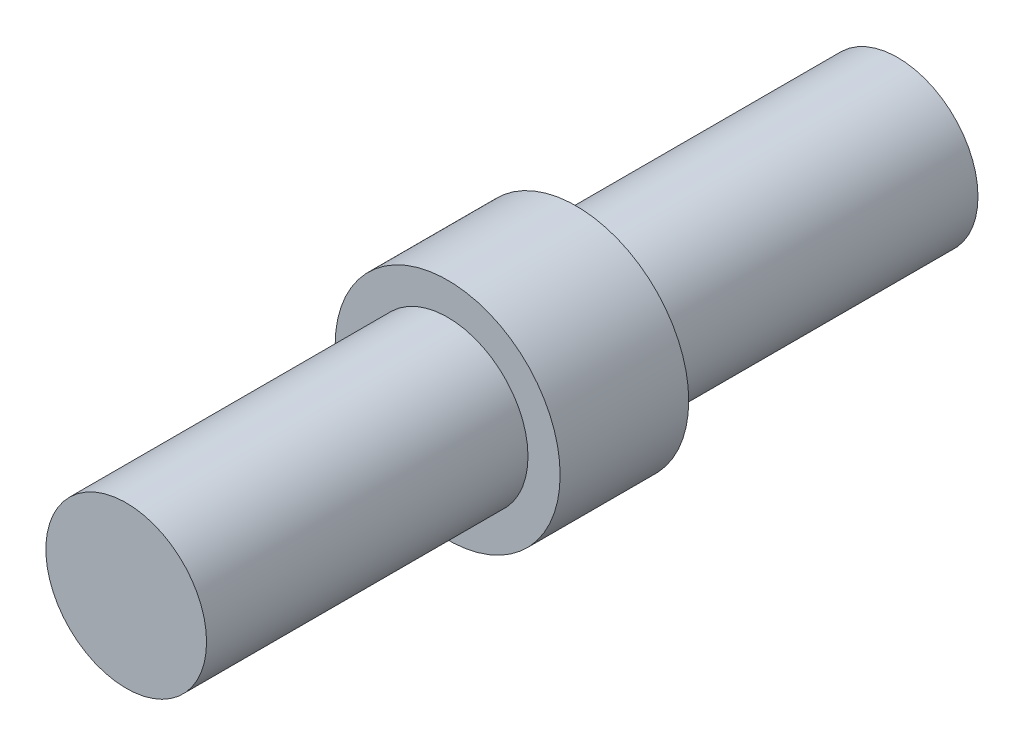
ISO-10303-21;
HEADER;
FILE_DESCRIPTION(('STEP AP214'),'2;1');
FILE_NAME('part.step','',(''),(''),'','','');
FILE_SCHEMA(('AUTOMOTIVE_DESIGN { 1 0 10303 214 1 1 1 1 }'));
ENDSEC;
DATA;
#1=APPLICATION_CONTEXT('core data for automotive mechanical design processes');
#2=APPLICATION_PROTOCOL_DEFINITION('international standard','automotive_design',2000,#1);
#3=PRODUCT_CONTEXT('',#1,'mechanical');
#4=PRODUCT('Part','Part','',(#3));
#5=PRODUCT_RELATED_PRODUCT_CATEGORY('part','',(#4));
#6=PRODUCT_DEFINITION_FORMATION('','',#4);
#7=PRODUCT_DEFINITION_CONTEXT('part definition',#1,'design');
#8=PRODUCT_DEFINITION('design','',#6,#7);
#9=PRODUCT_DEFINITION_SHAPE('','',#8);
#10=(LENGTH_UNIT() NAMED_UNIT(*) SI_UNIT(.MILLI.,.METRE.));
#11=(NAMED_UNIT(*) PLANE_ANGLE_UNIT() SI_UNIT($,.RADIAN.));
#12=(NAMED_UNIT(*) SI_UNIT($,.STERADIAN.) SOLID_ANGLE_UNIT());
#13=UNCERTAINTY_MEASURE_WITH_UNIT(LENGTH_MEASURE(1.E-05),#10,'distance_accuracy_value','');
#14=(GEOMETRIC_REPRESENTATION_CONTEXT(3) GLOBAL_UNCERTAINTY_ASSIGNED_CONTEXT((#13)) GLOBAL_UNIT_ASSIGNED_CONTEXT((#10,
#11,#12)) REPRESENTATION_CONTEXT('',''));
#15=CARTESIAN_POINT('',(0.,0.,0.));
#16=DIRECTION('',(0.,0.,1.));
#17=DIRECTION('',(1.,0.,0.));
#18=AXIS2_PLACEMENT_3D('',#15,#16,#17);
#19=CARTESIAN_POINT('',(0.,0.,10.));
#20=DIRECTION('',(0.,0.,-1.));
#21=DIRECTION('',(-1.,0.,0.));
#22=AXIS2_PLACEMENT_3D('',#19,#20,#21);
#23=CYLINDRICAL_SURFACE('',#22,2.5);
#24=CARTESIAN_POINT('',(0.,0.,10.));
#25=DIRECTION('',(0.,0.,1.));
#26=DIRECTION('',(1.,0.,0.));
#27=AXIS2_PLACEMENT_3D('',#24,#25,#26);
#28=CIRCLE('',#27,2.5);
#29=CARTESIAN_POINT('',(2.5,0.,10.));
#30=VERTEX_POINT('',#29);
#31=EDGE_CURVE('E42',#30,#30,#28,.T.);
#32=ORIENTED_EDGE('',*,*,#31,.F.);
#33=EDGE_LOOP('',(#32));
#34=FACE_BOUND('',#33,.T.);
#35=CARTESIAN_POINT('',(0.,0.,0.));
#36=DIRECTION('',(0.,0.,1.));
#37=DIRECTION('',(1.,0.,0.));
#38=AXIS2_PLACEMENT_3D('',#35,#36,#37);
#39=CIRCLE('',#38,2.5);
#40=CARTESIAN_POINT('',(2.5,0.,0.));
#41=VERTEX_POINT('',#40);
#42=EDGE_CURVE('E38',#41,#41,#39,.T.);
#43=ORIENTED_EDGE('',*,*,#42,.T.);
#44=EDGE_LOOP('',(#43));
#45=FACE_BOUND('',#44,.T.);
#46=ADVANCED_FACE('F35',(#34,#45),#23,.T.);
#47=CARTESIAN_POINT('',(0.,0.,0.));
#48=DIRECTION('',(0.,0.,1.));
#49=DIRECTION('',(1.,0.,0.));
#50=AXIS2_PLACEMENT_3D('',#47,#48,#49);
#51=PLANE('',#50);
#52=ORIENTED_EDGE('',*,*,#42,.F.);
#53=EDGE_LOOP('',(#52));
#54=FACE_BOUND('',#53,.T.);
#55=ADVANCED_FACE('F76',(#54),#51,.F.);
#56=CARTESIAN_POINT('',(0.,0.,14.));
#57=DIRECTION('',(0.,0.,-1.));
#58=DIRECTION('',(-1.,0.,0.));
#59=AXIS2_PLACEMENT_3D('',#56,#57,#58);
#60=CYLINDRICAL_SURFACE('',#59,3.5);
#61=CARTESIAN_POINT('',(0.,0.,14.));
#62=DIRECTION('',(0.,0.,1.));
#63=DIRECTION('',(1.,0.,0.));
#64=AXIS2_PLACEMENT_3D('',#61,#62,#63);
#65=CIRCLE('',#64,3.5);
#66=CARTESIAN_POINT('',(3.5,0.,14.));
#67=VERTEX_POINT('',#66);
#68=EDGE_CURVE('E50',#67,#67,#65,.T.);
#69=ORIENTED_EDGE('',*,*,#68,.F.);
#70=EDGE_LOOP('',(#69));
#71=FACE_BOUND('',#70,.T.);
#72=CARTESIAN_POINT('',(0.,0.,10.));
#73=DIRECTION('',(0.,0.,1.));
#74=DIRECTION('',(1.,0.,0.));
#75=AXIS2_PLACEMENT_3D('',#72,#73,#74);
#76=CIRCLE('',#75,3.5);
#77=CARTESIAN_POINT('',(3.5,0.,10.));
#78=VERTEX_POINT('',#77);
#79=EDGE_CURVE('E53',#78,#78,#76,.T.);
#80=ORIENTED_EDGE('',*,*,#79,.T.);
#81=EDGE_LOOP('',(#80));
#82=FACE_BOUND('',#81,.T.);
#83=ADVANCED_FACE('F81',(#71,#82),#60,.T.);
#84=CARTESIAN_POINT('',(0.,0.,14.));
#85=DIRECTION('',(0.,0.,1.));
#86=DIRECTION('',(1.,0.,0.));
#87=AXIS2_PLACEMENT_3D('',#84,#85,#86);
#88=PLANE('',#87);
#89=CARTESIAN_POINT('',(0.,0.,14.));
#90=DIRECTION('',(0.,0.,1.));
#91=DIRECTION('',(1.,0.,0.));
#92=AXIS2_PLACEMENT_3D('',#89,#90,#91);
#93=CIRCLE('',#92,2.5);
#94=CARTESIAN_POINT('',(2.5,0.,14.));
#95=VERTEX_POINT('',#94);
#96=EDGE_CURVE('E10',#95,#95,#93,.T.);
#97=ORIENTED_EDGE('',*,*,#96,.F.);
#98=EDGE_LOOP('',(#97));
#99=FACE_BOUND('',#98,.T.);
#100=ORIENTED_EDGE('',*,*,#68,.T.);
#101=EDGE_LOOP('',(#100));
#102=FACE_BOUND('',#101,.T.);
#103=ADVANCED_FACE('F71',(#99,#102),#88,.T.);
#104=CARTESIAN_POINT('',(0.,0.,10.));
#105=DIRECTION('',(0.,0.,1.));
#106=DIRECTION('',(1.,0.,0.));
#107=AXIS2_PLACEMENT_3D('',#104,#105,#106);
#108=PLANE('',#107);
#109=ORIENTED_EDGE('',*,*,#31,.T.);
#110=EDGE_LOOP('',(#109));
#111=FACE_BOUND('',#110,.T.);
#112=ORIENTED_EDGE('',*,*,#79,.F.);
#113=EDGE_LOOP('',(#112));
#114=FACE_BOUND('',#113,.T.);
#115=ADVANCED_FACE('F64',(#111,#114),#108,.F.);
#116=CARTESIAN_POINT('',(0.,0.,24.));
#117=DIRECTION('',(0.,0.,-1.));
#118=DIRECTION('',(-1.,0.,0.));
#119=AXIS2_PLACEMENT_3D('',#116,#117,#118);
#120=CYLINDRICAL_SURFACE('',#119,2.5);
#121=CARTESIAN_POINT('',(0.,0.,24.));
#122=DIRECTION('',(0.,0.,1.));
#123=DIRECTION('',(1.,0.,0.));
#124=AXIS2_PLACEMENT_3D('',#121,#122,#123);
#125=CIRCLE('',#124,2.5);
#126=CARTESIAN_POINT('',(2.5,0.,24.));
#127=VERTEX_POINT('',#126);
#128=EDGE_CURVE('E49',#127,#127,#125,.T.);
#129=ORIENTED_EDGE('',*,*,#128,.F.);
#130=EDGE_LOOP('',(#129));
#131=FACE_BOUND('',#130,.T.);
#132=ORIENTED_EDGE('',*,*,#96,.T.);
#133=EDGE_LOOP('',(#132));
#134=FACE_BOUND('',#133,.T.);
#135=ADVANCED_FACE('F62',(#131,#134),#120,.T.);
#136=CARTESIAN_POINT('',(0.,0.,24.));
#137=DIRECTION('',(0.,0.,1.));
#138=DIRECTION('',(1.,0.,0.));
#139=AXIS2_PLACEMENT_3D('',#136,#137,#138);
#140=PLANE('',#139);
#141=ORIENTED_EDGE('',*,*,#128,.T.);
#142=EDGE_LOOP('',(#141));
#143=FACE_BOUND('',#142,.T.);
#144=ADVANCED_FACE('F60',(#143),#140,.T.);
#145=CLOSED_SHELL('',(#46,#55,#83,#103,#115,#135,#144));
#146=MANIFOLD_SOLID_BREP('B2',#145);
#147=ADVANCED_BREP_SHAPE_REPRESENTATION('',(#18,#146),#14);
#148=SHAPE_DEFINITION_REPRESENTATION(#9,#147);
ENDSEC;
END-ISO-10303-21;
